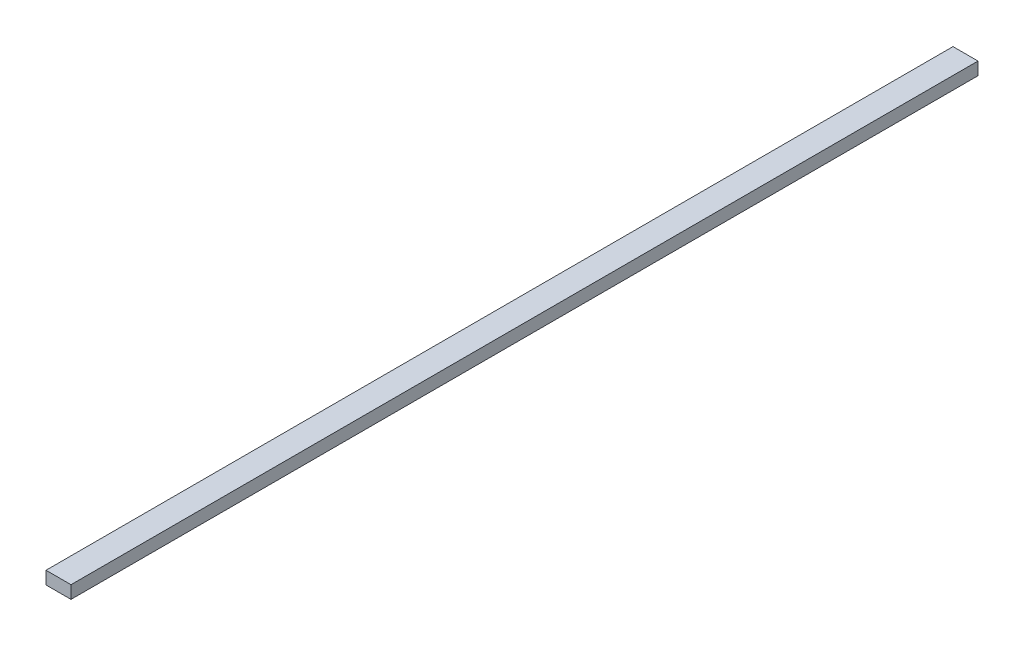
ISO-10303-21;
HEADER;
FILE_DESCRIPTION(('STEP AP214'),'2;1');
FILE_NAME('part.step','',(''),(''),'','','');
FILE_SCHEMA(('AUTOMOTIVE_DESIGN { 1 0 10303 214 1 1 1 1 }'));
ENDSEC;
DATA;
#1=APPLICATION_CONTEXT('core data for automotive mechanical design processes');
#2=APPLICATION_PROTOCOL_DEFINITION('international standard','automotive_design',2000,#1);
#3=PRODUCT_CONTEXT('',#1,'mechanical');
#4=PRODUCT('Part','Part','',(#3));
#5=PRODUCT_RELATED_PRODUCT_CATEGORY('part','',(#4));
#6=PRODUCT_DEFINITION_FORMATION('','',#4);
#7=PRODUCT_DEFINITION_CONTEXT('part definition',#1,'design');
#8=PRODUCT_DEFINITION('design','',#6,#7);
#9=PRODUCT_DEFINITION_SHAPE('','',#8);
#10=(LENGTH_UNIT() NAMED_UNIT(*) SI_UNIT(.MILLI.,.METRE.));
#11=(NAMED_UNIT(*) PLANE_ANGLE_UNIT() SI_UNIT($,.RADIAN.));
#12=(NAMED_UNIT(*) SI_UNIT($,.STERADIAN.) SOLID_ANGLE_UNIT());
#13=UNCERTAINTY_MEASURE_WITH_UNIT(LENGTH_MEASURE(1.E-05),#10,'distance_accuracy_value','');
#14=(GEOMETRIC_REPRESENTATION_CONTEXT(3) GLOBAL_UNCERTAINTY_ASSIGNED_CONTEXT((#13)) GLOBAL_UNIT_ASSIGNED_CONTEXT((#10,
#11,#12)) REPRESENTATION_CONTEXT('',''));
#15=CARTESIAN_POINT('',(0.,0.,0.));
#16=DIRECTION('',(0.,0.,1.));
#17=DIRECTION('',(1.,0.,0.));
#18=AXIS2_PLACEMENT_3D('',#15,#16,#17);
#19=CARTESIAN_POINT('',(-84.1621804374241,15.9452575941677,-234.95));
#20=DIRECTION('',(1.,0.,0.));
#21=DIRECTION('',(0.,0.,-1.));
#22=AXIS2_PLACEMENT_3D('',#19,#20,#21);
#23=PLANE('',#22);
#24=DIRECTION('',(0.,1.,0.));
#25=VECTOR('',#24,1.);
#26=CARTESIAN_POINT('',(-84.1621804374241,15.9452575941677,0.));
#27=LINE('',#26,#25);
#28=CARTESIAN_POINT('',(-84.1621804374241,15.9452575941677,0.));
#29=VERTEX_POINT('',#28);
#30=CARTESIAN_POINT('',(-84.1621804374241,19.2472575941677,0.));
#31=VERTEX_POINT('',#30);
#32=EDGE_CURVE('E57',#29,#31,#27,.T.);
#33=ORIENTED_EDGE('',*,*,#32,.F.);
#34=DIRECTION('',(0.,0.,1.));
#35=VECTOR('',#34,1.);
#36=CARTESIAN_POINT('',(-84.1621804374241,15.9452575941677,-234.95));
#37=LINE('',#36,#35);
#38=CARTESIAN_POINT('',(-84.1621804374241,15.9452575941677,-234.95));
#39=VERTEX_POINT('',#38);
#40=EDGE_CURVE('E32',#39,#29,#37,.T.);
#41=ORIENTED_EDGE('',*,*,#40,.F.);
#42=DIRECTION('',(0.,1.,0.));
#43=VECTOR('',#42,1.);
#44=CARTESIAN_POINT('',(-84.1621804374241,15.9452575941677,-234.95));
#45=LINE('',#44,#43);
#46=CARTESIAN_POINT('',(-84.1621804374241,19.2472575941677,-234.95));
#47=VERTEX_POINT('',#46);
#48=EDGE_CURVE('E59',#39,#47,#45,.T.);
#49=ORIENTED_EDGE('',*,*,#48,.T.);
#50=DIRECTION('',(0.,0.,1.));
#51=VECTOR('',#50,1.);
#52=CARTESIAN_POINT('',(-84.1621804374241,19.2472575941677,-234.95));
#53=LINE('',#52,#51);
#54=EDGE_CURVE('E9',#47,#31,#53,.T.);
#55=ORIENTED_EDGE('',*,*,#54,.T.);
#56=EDGE_LOOP('',(#33,#41,#49,#55));
#57=FACE_BOUND('',#56,.T.);
#58=ADVANCED_FACE('F15',(#57),#23,.T.);
#59=CARTESIAN_POINT('',(-84.1621804374241,19.2472575941677,-234.95));
#60=DIRECTION('',(0.,1.,0.));
#61=DIRECTION('',(0.,0.,1.));
#62=AXIS2_PLACEMENT_3D('',#59,#60,#61);
#63=PLANE('',#62);
#64=DIRECTION('',(-1.,0.,0.));
#65=VECTOR('',#64,1.);
#66=CARTESIAN_POINT('',(-84.1621804374241,19.2472575941677,0.));
#67=LINE('',#66,#65);
#68=CARTESIAN_POINT('',(-90.6391804374241,19.2472575941677,0.));
#69=VERTEX_POINT('',#68);
#70=EDGE_CURVE('E64',#31,#69,#67,.T.);
#71=ORIENTED_EDGE('',*,*,#70,.F.);
#72=ORIENTED_EDGE('',*,*,#54,.F.);
#73=DIRECTION('',(-1.,0.,0.));
#74=VECTOR('',#73,1.);
#75=CARTESIAN_POINT('',(-84.1621804374241,19.2472575941677,-234.95));
#76=LINE('',#75,#74);
#77=CARTESIAN_POINT('',(-90.6391804374241,19.2472575941677,-234.95));
#78=VERTEX_POINT('',#77);
#79=EDGE_CURVE('E86',#47,#78,#76,.T.);
#80=ORIENTED_EDGE('',*,*,#79,.T.);
#81=DIRECTION('',(0.,0.,1.));
#82=VECTOR('',#81,1.);
#83=CARTESIAN_POINT('',(-90.6391804374241,19.2472575941677,-234.95));
#84=LINE('',#83,#82);
#85=EDGE_CURVE('E24',#78,#69,#84,.T.);
#86=ORIENTED_EDGE('',*,*,#85,.T.);
#87=EDGE_LOOP('',(#71,#72,#80,#86));
#88=FACE_BOUND('',#87,.T.);
#89=ADVANCED_FACE('F65',(#88),#63,.T.);
#90=CARTESIAN_POINT('',(-90.6391804374241,19.2472575941677,-234.95));
#91=DIRECTION('',(-1.,0.,0.));
#92=DIRECTION('',(0.,0.,1.));
#93=AXIS2_PLACEMENT_3D('',#90,#91,#92);
#94=PLANE('',#93);
#95=DIRECTION('',(0.,-1.,0.));
#96=VECTOR('',#95,1.);
#97=CARTESIAN_POINT('',(-90.6391804374241,19.2472575941677,0.));
#98=LINE('',#97,#96);
#99=CARTESIAN_POINT('',(-90.6391804374241,15.9452575941677,0.));
#100=VERTEX_POINT('',#99);
#101=EDGE_CURVE('E70',#69,#100,#98,.T.);
#102=ORIENTED_EDGE('',*,*,#101,.F.);
#103=ORIENTED_EDGE('',*,*,#85,.F.);
#104=DIRECTION('',(0.,-1.,0.));
#105=VECTOR('',#104,1.);
#106=CARTESIAN_POINT('',(-90.6391804374241,19.2472575941677,-234.95));
#107=LINE('',#106,#105);
#108=CARTESIAN_POINT('',(-90.6391804374241,15.9452575941677,-234.95));
#109=VERTEX_POINT('',#108);
#110=EDGE_CURVE('E87',#78,#109,#107,.T.);
#111=ORIENTED_EDGE('',*,*,#110,.T.);
#112=DIRECTION('',(0.,0.,1.));
#113=VECTOR('',#112,1.);
#114=CARTESIAN_POINT('',(-90.6391804374241,15.9452575941677,-234.95));
#115=LINE('',#114,#113);
#116=EDGE_CURVE('E39',#109,#100,#115,.T.);
#117=ORIENTED_EDGE('',*,*,#116,.T.);
#118=EDGE_LOOP('',(#102,#103,#111,#117));
#119=FACE_BOUND('',#118,.T.);
#120=ADVANCED_FACE('F100',(#119),#94,.T.);
#121=CARTESIAN_POINT('',(-90.6391804374241,15.9452575941677,-234.95));
#122=DIRECTION('',(0.,-1.,0.));
#123=DIRECTION('',(0.,0.,-1.));
#124=AXIS2_PLACEMENT_3D('',#121,#122,#123);
#125=PLANE('',#124);
#126=DIRECTION('',(1.,0.,0.));
#127=VECTOR('',#126,1.);
#128=CARTESIAN_POINT('',(-90.6391804374241,15.9452575941677,0.));
#129=LINE('',#128,#127);
#130=EDGE_CURVE('E74',#100,#29,#129,.T.);
#131=ORIENTED_EDGE('',*,*,#130,.F.);
#132=ORIENTED_EDGE('',*,*,#116,.F.);
#133=DIRECTION('',(1.,0.,0.));
#134=VECTOR('',#133,1.);
#135=CARTESIAN_POINT('',(-90.6391804374241,15.9452575941677,-234.95));
#136=LINE('',#135,#134);
#137=EDGE_CURVE('E19',#109,#39,#136,.T.);
#138=ORIENTED_EDGE('',*,*,#137,.T.);
#139=ORIENTED_EDGE('',*,*,#40,.T.);
#140=EDGE_LOOP('',(#131,#132,#138,#139));
#141=FACE_BOUND('',#140,.T.);
#142=ADVANCED_FACE('F91',(#141),#125,.T.);
#143=CARTESIAN_POINT('',(0.,0.,-234.95));
#144=DIRECTION('',(0.,0.,1.));
#145=DIRECTION('',(1.,0.,0.));
#146=AXIS2_PLACEMENT_3D('',#143,#144,#145);
#147=PLANE('',#146);
#148=ORIENTED_EDGE('',*,*,#48,.F.);
#149=ORIENTED_EDGE('',*,*,#137,.F.);
#150=ORIENTED_EDGE('',*,*,#110,.F.);
#151=ORIENTED_EDGE('',*,*,#79,.F.);
#152=EDGE_LOOP('',(#148,#149,#150,#151));
#153=FACE_BOUND('',#152,.T.);
#154=ADVANCED_FACE('F17',(#153),#147,.F.);
#155=CARTESIAN_POINT('',(0.,0.,0.));
#156=DIRECTION('',(0.,0.,1.));
#157=DIRECTION('',(1.,0.,0.));
#158=AXIS2_PLACEMENT_3D('',#155,#156,#157);
#159=PLANE('',#158);
#160=ORIENTED_EDGE('',*,*,#32,.T.);
#161=ORIENTED_EDGE('',*,*,#70,.T.);
#162=ORIENTED_EDGE('',*,*,#101,.T.);
#163=ORIENTED_EDGE('',*,*,#130,.T.);
#164=EDGE_LOOP('',(#160,#161,#162,#163));
#165=FACE_BOUND('',#164,.T.);
#166=ADVANCED_FACE('F73',(#165),#159,.T.);
#167=CLOSED_SHELL('',(#58,#89,#120,#142,#154,#166));
#168=MANIFOLD_SOLID_BREP('B1',#167);
#169=ADVANCED_BREP_SHAPE_REPRESENTATION('',(#18,#168),#14);
#170=SHAPE_DEFINITION_REPRESENTATION(#9,#169);
ENDSEC;
END-ISO-10303-21;
